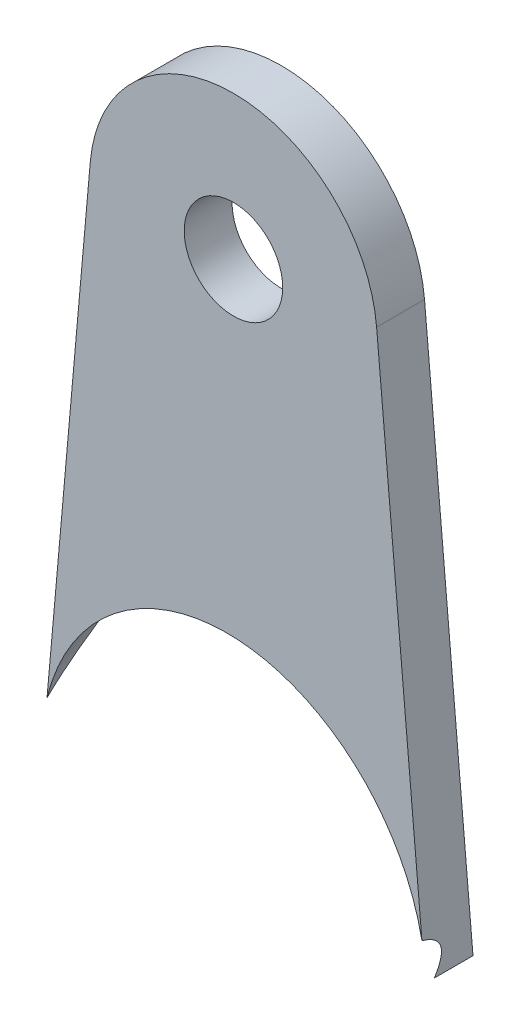
ISO-10303-21;
HEADER;
FILE_DESCRIPTION(('STEP AP214'),'2;1');
FILE_NAME('part.step','',(''),(''),'','','');
FILE_SCHEMA(('AUTOMOTIVE_DESIGN { 1 0 10303 214 1 1 1 1 }'));
ENDSEC;
DATA;
#1=APPLICATION_CONTEXT('core data for automotive mechanical design processes');
#2=APPLICATION_PROTOCOL_DEFINITION('international standard','automotive_design',2000,#1);
#3=PRODUCT_CONTEXT('',#1,'mechanical');
#4=PRODUCT('Part','Part','',(#3));
#5=PRODUCT_RELATED_PRODUCT_CATEGORY('part','',(#4));
#6=PRODUCT_DEFINITION_FORMATION('','',#4);
#7=PRODUCT_DEFINITION_CONTEXT('part definition',#1,'design');
#8=PRODUCT_DEFINITION('design','',#6,#7);
#9=PRODUCT_DEFINITION_SHAPE('','',#8);
#10=(LENGTH_UNIT() NAMED_UNIT(*) SI_UNIT(.MILLI.,.METRE.));
#11=(NAMED_UNIT(*) PLANE_ANGLE_UNIT() SI_UNIT($,.RADIAN.));
#12=(NAMED_UNIT(*) SI_UNIT($,.STERADIAN.) SOLID_ANGLE_UNIT());
#13=UNCERTAINTY_MEASURE_WITH_UNIT(LENGTH_MEASURE(1.E-05),#10,'distance_accuracy_value','');
#14=(GEOMETRIC_REPRESENTATION_CONTEXT(3) GLOBAL_UNCERTAINTY_ASSIGNED_CONTEXT((#13)) GLOBAL_UNIT_ASSIGNED_CONTEXT((#10,
#11,#12)) REPRESENTATION_CONTEXT('',''));
#15=CARTESIAN_POINT('',(0.,0.,0.));
#16=DIRECTION('',(0.,0.,1.));
#17=DIRECTION('',(1.,0.,0.));
#18=AXIS2_PLACEMENT_3D('',#15,#16,#17);
#19=CARTESIAN_POINT('',(0.,-35.211766,-3.175));
#20=DIRECTION('',(0.,1.,0.));
#21=DIRECTION('',(0.,0.,-1.));
#22=AXIS2_PLACEMENT_3D('',#19,#20,#21);
#23=PLANE('',#22);
#24=CARTESIAN_POINT('',(0.00476535948146228,-35.211766,0.0475119253670053));
#25=DIRECTION('',(0.,-1.,0.));
#26=DIRECTION('',(0.0997974651314206,0.,0.995007771805498));
#27=AXIS2_PLACEMENT_3D('',#24,#25,#26);
#28=ELLIPSE('',#27,37.0787894374957,12.7);
#29=CARTESIAN_POINT('',(12.7,-35.211766,-0.618393753774304));
#30=VERTEX_POINT('',#29);
#31=CARTESIAN_POINT('',(12.427305830985,-35.211766,-3.175));
#32=VERTEX_POINT('',#31);
#33=EDGE_CURVE('E11',#30,#32,#28,.F.);
#34=ORIENTED_EDGE('',*,*,#33,.T.);
#35=DIRECTION('',(1.,0.,0.));
#36=VECTOR('',#35,1.);
#37=CARTESIAN_POINT('',(0.,-35.211766,-3.175));
#38=LINE('',#37,#36);
#39=CARTESIAN_POINT('',(12.7,-35.211766,-3.175));
#40=VERTEX_POINT('',#39);
#41=EDGE_CURVE('E48',#32,#40,#38,.T.);
#42=ORIENTED_EDGE('',*,*,#41,.T.);
#43=DIRECTION('',(0.,0.,1.));
#44=VECTOR('',#43,1.);
#45=CARTESIAN_POINT('',(12.7,-35.211766,-3.175));
#46=LINE('',#45,#44);
#47=EDGE_CURVE('E107',#40,#30,#46,.T.);
#48=ORIENTED_EDGE('',*,*,#47,.T.);
#49=EDGE_LOOP('',(#34,#42,#48));
#50=FACE_BOUND('',#49,.T.);
#51=ADVANCED_FACE('F45',(#50),#23,.F.);
#52=CARTESIAN_POINT('',(-9.48741743158892,0.8453020044828,-3.175));
#53=DIRECTION('',(-0.996054323526396,0.0887456172685354,0.));
#54=DIRECTION('',(-0.0887456172685354,-0.996054323526396,0.));
#55=AXIS2_PLACEMENT_3D('',#52,#53,#54);
#56=PLANE('',#55);
#57=DIRECTION('',(0.0887456172685355,0.996054323526396,0.));
#58=VECTOR('',#57,1.);
#59=CARTESIAN_POINT('',(-9.48741743158892,0.8453020044828,0.));
#60=LINE('',#59,#58);
#61=CARTESIAN_POINT('',(-12.3566536170662,-31.3581486641318,0.));
#62=VERTEX_POINT('',#61);
#63=CARTESIAN_POINT('',(-9.48741743158892,0.8453020044828,0.));
#64=VERTEX_POINT('',#63);
#65=EDGE_CURVE('E126',#62,#64,#60,.T.);
#66=ORIENTED_EDGE('',*,*,#65,.T.);
#67=DIRECTION('',(0.,0.,1.));
#68=VECTOR('',#67,1.);
#69=CARTESIAN_POINT('',(-9.48741743158892,0.8453020044828,-3.175));
#70=LINE('',#69,#68);
#71=CARTESIAN_POINT('',(-9.48741743158892,0.8453020044828,-3.175));
#72=VERTEX_POINT('',#71);
#73=EDGE_CURVE('E130',#72,#64,#70,.T.);
#74=ORIENTED_EDGE('',*,*,#73,.F.);
#75=DIRECTION('',(0.0887456172685355,0.996054323526396,0.));
#76=VECTOR('',#75,1.);
#77=CARTESIAN_POINT('',(-9.48741743158892,0.8453020044828,-3.175));
#78=LINE('',#77,#76);
#79=CARTESIAN_POINT('',(-12.0913929693227,-28.3809423166134,-3.175));
#80=VERTEX_POINT('',#79);
#81=EDGE_CURVE('E121',#80,#72,#78,.T.);
#82=ORIENTED_EDGE('',*,*,#81,.F.);
#83=CARTESIAN_POINT('',(-9.58028855231808,-0.197055738695745,-95.5180730607442));
#84=DIRECTION('',(0.996054323526396,-0.0887456172685354,0.));
#85=DIRECTION('',(-0.029767176416292,-0.334097904563597,0.942068206328191));
#86=AXIS2_PLACEMENT_3D('',#83,#84,#85);
#87=ELLIPSE('',#86,102.595050637198,12.7);
#88=EDGE_CURVE('E122',#62,#80,#87,.F.);
#89=ORIENTED_EDGE('',*,*,#88,.F.);
#90=EDGE_LOOP('',(#66,#74,#82,#89));
#91=FACE_BOUND('',#90,.T.);
#92=ADVANCED_FACE('F142',(#91),#56,.T.);
#93=CARTESIAN_POINT('',(9.48741743158892,0.845302004482802,-3.175));
#94=DIRECTION('',(-0.996054323526396,-0.0887456172685356,0.));
#95=DIRECTION('',(0.0887456172685356,-0.996054323526396,0.));
#96=AXIS2_PLACEMENT_3D('',#93,#94,#95);
#97=PLANE('',#96);
#98=CARTESIAN_POINT('',(18.8258114413649,-103.966045468427,187.698441739288));
#99=DIRECTION('',(0.996054323526396,0.0887456172685356,0.));
#100=DIRECTION('',(0.0310768342073605,-0.348797112764341,0.936682872963367));
#101=AXIS2_PLACEMENT_3D('',#98,#99,#100);
#102=ELLIPSE('',#101,201.605104853114,12.7);
#103=CARTESIAN_POINT('',(12.49155158954,-32.8722032490573,0.));
#104=VERTEX_POINT('',#103);
#105=EDGE_CURVE('E54',#104,#30,#102,.F.);
#106=ORIENTED_EDGE('',*,*,#105,.T.);
#107=ORIENTED_EDGE('',*,*,#47,.F.);
#108=DIRECTION('',(-0.0887456172685356,0.996054323526396,0.));
#109=VECTOR('',#108,1.);
#110=CARTESIAN_POINT('',(9.48741743158892,0.845302004482802,-3.175));
#111=LINE('',#110,#109);
#112=CARTESIAN_POINT('',(9.48741743158892,0.845302004482802,-3.175));
#113=VERTEX_POINT('',#112);
#114=EDGE_CURVE('E101',#40,#113,#111,.T.);
#115=ORIENTED_EDGE('',*,*,#114,.T.);
#116=DIRECTION('',(0.,0.,1.));
#117=VECTOR('',#116,1.);
#118=CARTESIAN_POINT('',(9.48741743158892,0.845302004482802,-3.175));
#119=LINE('',#118,#117);
#120=CARTESIAN_POINT('',(9.48741743158892,0.845302004482802,0.));
#121=VERTEX_POINT('',#120);
#122=EDGE_CURVE('E117',#113,#121,#119,.T.);
#123=ORIENTED_EDGE('',*,*,#122,.T.);
#124=DIRECTION('',(-0.0887456172685356,0.996054323526396,0.));
#125=VECTOR('',#124,1.);
#126=CARTESIAN_POINT('',(9.48741743158892,0.845302004482802,0.));
#127=LINE('',#126,#125);
#128=EDGE_CURVE('E112',#104,#121,#127,.T.);
#129=ORIENTED_EDGE('',*,*,#128,.F.);
#130=EDGE_LOOP('',(#106,#107,#115,#123,#129));
#131=FACE_BOUND('',#130,.T.);
#132=ADVANCED_FACE('F108',(#131),#97,.F.);
#133=CARTESIAN_POINT('',(0.,0.,-3.175));
#134=DIRECTION('',(0.,0.,1.));
#135=DIRECTION('',(-1.,0.,0.));
#136=AXIS2_PLACEMENT_3D('',#133,#134,#135);
#137=CYLINDRICAL_SURFACE('',#136,9.525);
#138=CARTESIAN_POINT('',(0.,0.,0.));
#139=DIRECTION('',(0.,0.,1.));
#140=DIRECTION('',(1.,0.,0.));
#141=AXIS2_PLACEMENT_3D('',#138,#139,#140);
#142=CIRCLE('',#141,9.525);
#143=EDGE_CURVE('E111',#121,#64,#142,.T.);
#144=ORIENTED_EDGE('',*,*,#143,.F.);
#145=ORIENTED_EDGE('',*,*,#122,.F.);
#146=CARTESIAN_POINT('',(0.,0.,-3.175));
#147=DIRECTION('',(0.,0.,1.));
#148=DIRECTION('',(1.,0.,0.));
#149=AXIS2_PLACEMENT_3D('',#146,#147,#148);
#150=CIRCLE('',#149,9.525);
#151=EDGE_CURVE('E98',#113,#72,#150,.T.);
#152=ORIENTED_EDGE('',*,*,#151,.T.);
#153=ORIENTED_EDGE('',*,*,#73,.T.);
#154=EDGE_LOOP('',(#144,#145,#152,#153));
#155=FACE_BOUND('',#154,.T.);
#156=ADVANCED_FACE('F138',(#155),#137,.T.);
#157=CARTESIAN_POINT('',(0.,0.,-3.175));
#158=DIRECTION('',(0.,0.,1.));
#159=DIRECTION('',(-1.,0.,0.));
#160=AXIS2_PLACEMENT_3D('',#157,#158,#159);
#161=CYLINDRICAL_SURFACE('',#160,3.2639);
#162=CARTESIAN_POINT('',(0.,0.,-3.175));
#163=DIRECTION('',(0.,0.,1.));
#164=DIRECTION('',(1.,0.,0.));
#165=AXIS2_PLACEMENT_3D('',#162,#163,#164);
#166=CIRCLE('',#165,3.2639);
#167=CARTESIAN_POINT('',(3.2639,0.,-3.175));
#168=VERTEX_POINT('',#167);
#169=EDGE_CURVE('E114',#168,#168,#166,.T.);
#170=ORIENTED_EDGE('',*,*,#169,.F.);
#171=EDGE_LOOP('',(#170));
#172=FACE_BOUND('',#171,.T.);
#173=CARTESIAN_POINT('',(0.,0.,0.));
#174=DIRECTION('',(0.,0.,1.));
#175=DIRECTION('',(1.,0.,0.));
#176=AXIS2_PLACEMENT_3D('',#173,#174,#175);
#177=CIRCLE('',#176,3.2639);
#178=CARTESIAN_POINT('',(3.2639,0.,0.));
#179=VERTEX_POINT('',#178);
#180=EDGE_CURVE('E123',#179,#179,#177,.T.);
#181=ORIENTED_EDGE('',*,*,#180,.T.);
#182=EDGE_LOOP('',(#181));
#183=FACE_BOUND('',#182,.T.);
#184=ADVANCED_FACE('F164',(#172,#183),#161,.F.);
#185=CARTESIAN_POINT('',(0.,0.,-3.175));
#186=DIRECTION('',(0.,0.,-1.));
#187=DIRECTION('',(1.,0.,0.));
#188=AXIS2_PLACEMENT_3D('',#185,#186,#187);
#189=PLANE('',#188);
#190=ORIENTED_EDGE('',*,*,#81,.T.);
#191=ORIENTED_EDGE('',*,*,#151,.F.);
#192=ORIENTED_EDGE('',*,*,#114,.F.);
#193=ORIENTED_EDGE('',*,*,#41,.F.);
#194=CARTESIAN_POINT('',(-0.31844671043417,-34.0310551677823,-3.17500000000004));
#195=DIRECTION('',(0.,0.,1.));
#196=DIRECTION('',(0.264029713718803,-0.964514546429222,0.));
#197=AXIS2_PLACEMENT_3D('',#194,#195,#196);
#198=ELLIPSE('',#197,13.5854666633653,12.7);
#199=EDGE_CURVE('E63',#80,#32,#198,.F.);
#200=ORIENTED_EDGE('',*,*,#199,.F.);
#201=EDGE_LOOP('',(#190,#191,#192,#193,#200));
#202=FACE_BOUND('',#201,.T.);
#203=ORIENTED_EDGE('',*,*,#169,.T.);
#204=EDGE_LOOP('',(#203));
#205=FACE_BOUND('',#204,.T.);
#206=ADVANCED_FACE('F102',(#202,#205),#189,.T.);
#207=CARTESIAN_POINT('',(0.,0.,0.));
#208=DIRECTION('',(0.,0.,-1.));
#209=DIRECTION('',(1.,0.,0.));
#210=AXIS2_PLACEMENT_3D('',#207,#208,#209);
#211=PLANE('',#210);
#212=CARTESIAN_POINT('',(4.38538094726937E-12,-35.1943578891102,0.));
#213=DIRECTION('',(0.,0.,1.));
#214=DIRECTION('',(0.264029713718803,-0.964514546429222,0.));
#215=AXIS2_PLACEMENT_3D('',#212,#213,#214);
#216=ELLIPSE('',#215,13.5854666633653,12.7);
#217=EDGE_CURVE('E82',#62,#104,#216,.F.);
#218=ORIENTED_EDGE('',*,*,#217,.T.);
#219=ORIENTED_EDGE('',*,*,#128,.T.);
#220=ORIENTED_EDGE('',*,*,#143,.T.);
#221=ORIENTED_EDGE('',*,*,#65,.F.);
#222=EDGE_LOOP('',(#218,#219,#220,#221));
#223=FACE_BOUND('',#222,.T.);
#224=ORIENTED_EDGE('',*,*,#180,.F.);
#225=EDGE_LOOP('',(#224));
#226=FACE_BOUND('',#225,.T.);
#227=ADVANCED_FACE('F143',(#223,#226),#211,.F.);
#228=CARTESIAN_POINT('',(-68.9938996246935,216.844016374217,-687.887876143349));
#229=DIRECTION('',(0.0937609927812885,-0.342513879030722,0.934822506631069));
#230=DIRECTION('',(0.902184120214296,-0.367856186909638,-0.225267927112269));
#231=AXIS2_PLACEMENT_3D('',#228,#229,#230);
#232=CYLINDRICAL_SURFACE('',#231,12.7);
#233=ORIENTED_EDGE('',*,*,#88,.T.);
#234=ORIENTED_EDGE('',*,*,#199,.T.);
#235=ORIENTED_EDGE('',*,*,#33,.F.);
#236=ORIENTED_EDGE('',*,*,#105,.F.);
#237=ORIENTED_EDGE('',*,*,#217,.F.);
#238=EDGE_LOOP('',(#233,#234,#235,#236,#237));
#239=FACE_BOUND('',#238,.T.);
#240=ADVANCED_FACE('F145',(#239),#232,.F.);
#241=CLOSED_SHELL('',(#51,#92,#132,#156,#184,#206,#227,#240));
#242=MANIFOLD_SOLID_BREP('B2',#241);
#243=ADVANCED_BREP_SHAPE_REPRESENTATION('',(#18,#242),#14);
#244=SHAPE_DEFINITION_REPRESENTATION(#9,#243);
ENDSEC;
END-ISO-10303-21;
